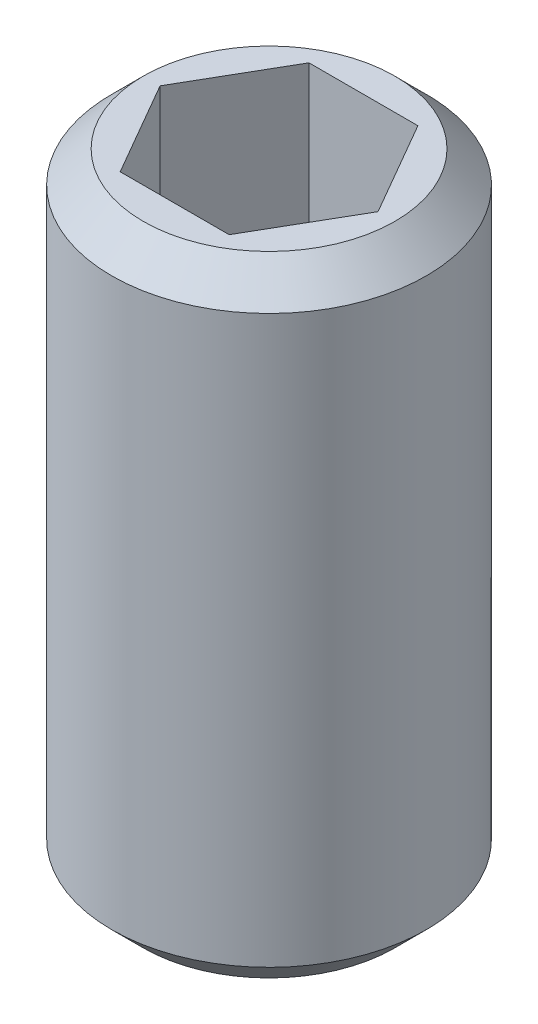
ISO-10303-21;
HEADER;
FILE_DESCRIPTION(('STEP AP214'),'2;1');
FILE_NAME('part.step','',(''),(''),'','','');
FILE_SCHEMA(('AUTOMOTIVE_DESIGN { 1 0 10303 214 1 1 1 1 }'));
ENDSEC;
DATA;
#1=APPLICATION_CONTEXT('core data for automotive mechanical design processes');
#2=APPLICATION_PROTOCOL_DEFINITION('international standard','automotive_design',2000,#1);
#3=PRODUCT_CONTEXT('',#1,'mechanical');
#4=PRODUCT('Part','Part','',(#3));
#5=PRODUCT_RELATED_PRODUCT_CATEGORY('part','',(#4));
#6=PRODUCT_DEFINITION_FORMATION('','',#4);
#7=PRODUCT_DEFINITION_CONTEXT('part definition',#1,'design');
#8=PRODUCT_DEFINITION('design','',#6,#7);
#9=PRODUCT_DEFINITION_SHAPE('','',#8);
#10=(LENGTH_UNIT() NAMED_UNIT(*) SI_UNIT(.MILLI.,.METRE.));
#11=(NAMED_UNIT(*) PLANE_ANGLE_UNIT() SI_UNIT($,.RADIAN.));
#12=(NAMED_UNIT(*) SI_UNIT($,.STERADIAN.) SOLID_ANGLE_UNIT());
#13=UNCERTAINTY_MEASURE_WITH_UNIT(LENGTH_MEASURE(1.E-05),#10,'distance_accuracy_value','');
#14=(GEOMETRIC_REPRESENTATION_CONTEXT(3) GLOBAL_UNCERTAINTY_ASSIGNED_CONTEXT((#13)) GLOBAL_UNIT_ASSIGNED_CONTEXT((#10,
#11,#12)) REPRESENTATION_CONTEXT('',''));
#15=CARTESIAN_POINT('',(0.,0.,0.));
#16=DIRECTION('',(0.,0.,1.));
#17=DIRECTION('',(1.,0.,0.));
#18=AXIS2_PLACEMENT_3D('',#15,#16,#17);
#19=CARTESIAN_POINT('',(42.2075255899707,10.,-13.1133240942481));
#20=DIRECTION('',(0.,-1.,0.));
#21=DIRECTION('',(0.,0.,-1.));
#22=AXIS2_PLACEMENT_3D('',#19,#20,#21);
#23=CYLINDRICAL_SURFACE('',#22,2.5);
#24=CARTESIAN_POINT('',(42.2075255899707,0.500000000000002,-13.1133240942481));
#25=DIRECTION('',(0.,1.,0.));
#26=DIRECTION('',(0.,0.,1.));
#27=AXIS2_PLACEMENT_3D('',#24,#25,#26);
#28=CIRCLE('',#27,2.5);
#29=CARTESIAN_POINT('',(42.2075255899707,0.500000000000002,-10.6133240942481));
#30=VERTEX_POINT('',#29);
#31=EDGE_CURVE('E150',#30,#30,#28,.T.);
#32=ORIENTED_EDGE('',*,*,#31,.T.);
#33=EDGE_LOOP('',(#32));
#34=FACE_BOUND('',#33,.T.);
#35=CARTESIAN_POINT('',(42.2075255899707,9.49999999999999,-13.1133240942481));
#36=DIRECTION('',(0.,1.,0.));
#37=DIRECTION('',(0.,0.,1.));
#38=AXIS2_PLACEMENT_3D('',#35,#36,#37);
#39=CIRCLE('',#38,2.5);
#40=CARTESIAN_POINT('',(42.2075255899707,9.49999999999999,-10.6133240942481));
#41=VERTEX_POINT('',#40);
#42=EDGE_CURVE('E142',#41,#41,#39,.F.);
#43=ORIENTED_EDGE('',*,*,#42,.T.);
#44=EDGE_LOOP('',(#43));
#45=FACE_BOUND('',#44,.T.);
#46=ADVANCED_FACE('F39',(#34,#45),#23,.T.);
#47=CARTESIAN_POINT('',(42.2075255899707,10.,-13.1133240942481));
#48=DIRECTION('',(0.,1.,0.));
#49=DIRECTION('',(0.,0.,1.));
#50=AXIS2_PLACEMENT_3D('',#47,#48,#49);
#51=PLANE('',#50);
#52=CARTESIAN_POINT('',(42.2075255899707,10.,-13.1133240942481));
#53=DIRECTION('',(0.,1.,0.));
#54=DIRECTION('',(0.,0.,1.));
#55=AXIS2_PLACEMENT_3D('',#52,#53,#54);
#56=CIRCLE('',#55,2.);
#57=CARTESIAN_POINT('',(42.2075255899707,10.,-11.1133240942481));
#58=VERTEX_POINT('',#57);
#59=EDGE_CURVE('E11',#58,#58,#56,.T.);
#60=ORIENTED_EDGE('',*,*,#59,.T.);
#61=EDGE_LOOP('',(#60));
#62=FACE_BOUND('',#61,.T.);
#63=DIRECTION('',(0.499999999999999,0.,-0.866025403784439));
#64=VECTOR('',#63,1.);
#65=CARTESIAN_POINT('',(43.0735509937552,10.,-11.6133240942481));
#66=LINE('',#65,#64);
#67=CARTESIAN_POINT('',(43.0735509937552,10.,-11.6133240942481));
#68=VERTEX_POINT('',#67);
#69=CARTESIAN_POINT('',(43.9395763975396,10.,-13.1133240942481));
#70=VERTEX_POINT('',#69);
#71=EDGE_CURVE('E55',#68,#70,#66,.T.);
#72=ORIENTED_EDGE('',*,*,#71,.F.);
#73=DIRECTION('',(1.,0.,0.));
#74=VECTOR('',#73,1.);
#75=CARTESIAN_POINT('',(41.3415001861863,10.,-11.6133240942481));
#76=LINE('',#75,#74);
#77=CARTESIAN_POINT('',(41.3415001861863,10.,-11.6133240942481));
#78=VERTEX_POINT('',#77);
#79=EDGE_CURVE('E138',#78,#68,#76,.T.);
#80=ORIENTED_EDGE('',*,*,#79,.F.);
#81=DIRECTION('',(0.500000000000001,0.,0.866025403784438));
#82=VECTOR('',#81,1.);
#83=CARTESIAN_POINT('',(40.4754747824018,10.,-13.1133240942481));
#84=LINE('',#83,#82);
#85=CARTESIAN_POINT('',(40.4754747824018,10.,-13.1133240942481));
#86=VERTEX_POINT('',#85);
#87=EDGE_CURVE('E136',#86,#78,#84,.T.);
#88=ORIENTED_EDGE('',*,*,#87,.F.);
#89=DIRECTION('',(-0.500000000000002,0.,0.866025403784438));
#90=VECTOR('',#89,1.);
#91=CARTESIAN_POINT('',(41.3415001861863,10.,-14.6133240942482));
#92=LINE('',#91,#90);
#93=CARTESIAN_POINT('',(41.3415001861863,10.,-14.6133240942482));
#94=VERTEX_POINT('',#93);
#95=EDGE_CURVE('E103',#94,#86,#92,.T.);
#96=ORIENTED_EDGE('',*,*,#95,.F.);
#97=DIRECTION('',(-1.,0.,0.));
#98=VECTOR('',#97,1.);
#99=CARTESIAN_POINT('',(43.0735509937552,10.,-14.6133240942482));
#100=LINE('',#99,#98);
#101=CARTESIAN_POINT('',(43.0735509937552,10.,-14.6133240942482));
#102=VERTEX_POINT('',#101);
#103=EDGE_CURVE('E132',#102,#94,#100,.T.);
#104=ORIENTED_EDGE('',*,*,#103,.F.);
#105=DIRECTION('',(-0.499999999999998,0.,-0.86602540378444));
#106=VECTOR('',#105,1.);
#107=CARTESIAN_POINT('',(43.9395763975396,10.,-13.1133240942481));
#108=LINE('',#107,#106);
#109=EDGE_CURVE('E129',#70,#102,#108,.T.);
#110=ORIENTED_EDGE('',*,*,#109,.F.);
#111=EDGE_LOOP('',(#72,#80,#88,#96,#104,#110));
#112=FACE_BOUND('',#111,.T.);
#113=ADVANCED_FACE('F164',(#62,#112),#51,.T.);
#114=CARTESIAN_POINT('',(42.2075255899707,0.,-13.1133240942481));
#115=DIRECTION('',(0.,1.,0.));
#116=DIRECTION('',(0.,0.,1.));
#117=AXIS2_PLACEMENT_3D('',#114,#115,#116);
#118=PLANE('',#117);
#119=CARTESIAN_POINT('',(42.2075255899707,0.,-13.1133240942481));
#120=DIRECTION('',(0.,1.,0.));
#121=DIRECTION('',(0.,0.,1.));
#122=AXIS2_PLACEMENT_3D('',#119,#120,#121);
#123=CIRCLE('',#122,2.);
#124=CARTESIAN_POINT('',(42.2075255899707,0.,-11.1133240942481));
#125=VERTEX_POINT('',#124);
#126=EDGE_CURVE('E48',#125,#125,#123,.F.);
#127=ORIENTED_EDGE('',*,*,#126,.T.);
#128=EDGE_LOOP('',(#127));
#129=FACE_BOUND('',#128,.T.);
#130=ADVANCED_FACE('F155',(#129),#118,.F.);
#131=CARTESIAN_POINT('',(43.0735509937552,7.,-11.6133240942481));
#132=DIRECTION('',(0.866025403784439,0.,0.499999999999999));
#133=DIRECTION('',(0.499999999999999,0.,-0.866025403784439));
#134=AXIS2_PLACEMENT_3D('',#131,#132,#133);
#135=PLANE('',#134);
#136=ORIENTED_EDGE('',*,*,#71,.T.);
#137=DIRECTION('',(0.,1.,0.));
#138=VECTOR('',#137,1.);
#139=CARTESIAN_POINT('',(43.9395763975396,7.,-13.1133240942481));
#140=LINE('',#139,#138);
#141=CARTESIAN_POINT('',(43.9395763975396,7.,-13.1133240942481));
#142=VERTEX_POINT('',#141);
#143=EDGE_CURVE('E85',#142,#70,#140,.T.);
#144=ORIENTED_EDGE('',*,*,#143,.F.);
#145=DIRECTION('',(0.499999999999999,0.,-0.866025403784439));
#146=VECTOR('',#145,1.);
#147=CARTESIAN_POINT('',(43.0735509937552,7.,-11.6133240942481));
#148=LINE('',#147,#146);
#149=CARTESIAN_POINT('',(43.0735509937552,7.,-11.6133240942481));
#150=VERTEX_POINT('',#149);
#151=EDGE_CURVE('E140',#150,#142,#148,.T.);
#152=ORIENTED_EDGE('',*,*,#151,.F.);
#153=DIRECTION('',(0.,1.,0.));
#154=VECTOR('',#153,1.);
#155=CARTESIAN_POINT('',(43.0735509937552,7.,-11.6133240942481));
#156=LINE('',#155,#154);
#157=EDGE_CURVE('E63',#150,#68,#156,.T.);
#158=ORIENTED_EDGE('',*,*,#157,.T.);
#159=EDGE_LOOP('',(#136,#144,#152,#158));
#160=FACE_BOUND('',#159,.T.);
#161=ADVANCED_FACE('F181',(#160),#135,.F.);
#162=CARTESIAN_POINT('',(41.3415001861863,7.,-11.6133240942481));
#163=DIRECTION('',(0.,0.,1.));
#164=DIRECTION('',(1.,0.,0.));
#165=AXIS2_PLACEMENT_3D('',#162,#163,#164);
#166=PLANE('',#165);
#167=ORIENTED_EDGE('',*,*,#79,.T.);
#168=ORIENTED_EDGE('',*,*,#157,.F.);
#169=DIRECTION('',(1.,0.,0.));
#170=VECTOR('',#169,1.);
#171=CARTESIAN_POINT('',(41.3415001861863,7.,-11.6133240942481));
#172=LINE('',#171,#170);
#173=CARTESIAN_POINT('',(41.3415001861863,7.,-11.6133240942481));
#174=VERTEX_POINT('',#173);
#175=EDGE_CURVE('E115',#174,#150,#172,.T.);
#176=ORIENTED_EDGE('',*,*,#175,.F.);
#177=DIRECTION('',(0.,1.,0.));
#178=VECTOR('',#177,1.);
#179=CARTESIAN_POINT('',(41.3415001861863,7.,-11.6133240942481));
#180=LINE('',#179,#178);
#181=EDGE_CURVE('E107',#174,#78,#180,.T.);
#182=ORIENTED_EDGE('',*,*,#181,.T.);
#183=EDGE_LOOP('',(#167,#168,#176,#182));
#184=FACE_BOUND('',#183,.T.);
#185=ADVANCED_FACE('F183',(#184),#166,.F.);
#186=CARTESIAN_POINT('',(40.4754747824018,7.,-13.1133240942481));
#187=DIRECTION('',(-0.866025403784438,0.,0.500000000000001));
#188=DIRECTION('',(0.500000000000001,0.,0.866025403784438));
#189=AXIS2_PLACEMENT_3D('',#186,#187,#188);
#190=PLANE('',#189);
#191=ORIENTED_EDGE('',*,*,#87,.T.);
#192=ORIENTED_EDGE('',*,*,#181,.F.);
#193=DIRECTION('',(0.500000000000001,0.,0.866025403784438));
#194=VECTOR('',#193,1.);
#195=CARTESIAN_POINT('',(40.4754747824018,7.,-13.1133240942481));
#196=LINE('',#195,#194);
#197=CARTESIAN_POINT('',(40.4754747824018,7.,-13.1133240942481));
#198=VERTEX_POINT('',#197);
#199=EDGE_CURVE('E111',#198,#174,#196,.T.);
#200=ORIENTED_EDGE('',*,*,#199,.F.);
#201=DIRECTION('',(0.,1.,0.));
#202=VECTOR('',#201,1.);
#203=CARTESIAN_POINT('',(40.4754747824018,7.,-13.1133240942481));
#204=LINE('',#203,#202);
#205=EDGE_CURVE('E96',#198,#86,#204,.T.);
#206=ORIENTED_EDGE('',*,*,#205,.T.);
#207=EDGE_LOOP('',(#191,#192,#200,#206));
#208=FACE_BOUND('',#207,.T.);
#209=ADVANCED_FACE('F112',(#208),#190,.F.);
#210=CARTESIAN_POINT('',(41.3415001861863,7.,-14.6133240942482));
#211=DIRECTION('',(-0.866025403784438,0.,-0.500000000000002));
#212=DIRECTION('',(-0.500000000000002,0.,0.866025403784438));
#213=AXIS2_PLACEMENT_3D('',#210,#211,#212);
#214=PLANE('',#213);
#215=ORIENTED_EDGE('',*,*,#95,.T.);
#216=ORIENTED_EDGE('',*,*,#205,.F.);
#217=DIRECTION('',(-0.500000000000002,0.,0.866025403784438));
#218=VECTOR('',#217,1.);
#219=CARTESIAN_POINT('',(41.3415001861863,7.,-14.6133240942482));
#220=LINE('',#219,#218);
#221=CARTESIAN_POINT('',(41.3415001861863,7.,-14.6133240942482));
#222=VERTEX_POINT('',#221);
#223=EDGE_CURVE('E100',#222,#198,#220,.T.);
#224=ORIENTED_EDGE('',*,*,#223,.F.);
#225=DIRECTION('',(0.,1.,0.));
#226=VECTOR('',#225,1.);
#227=CARTESIAN_POINT('',(41.3415001861863,7.,-14.6133240942482));
#228=LINE('',#227,#226);
#229=EDGE_CURVE('E108',#222,#94,#228,.T.);
#230=ORIENTED_EDGE('',*,*,#229,.T.);
#231=EDGE_LOOP('',(#215,#216,#224,#230));
#232=FACE_BOUND('',#231,.T.);
#233=ADVANCED_FACE('F98',(#232),#214,.F.);
#234=CARTESIAN_POINT('',(43.0735509937552,7.,-14.6133240942482));
#235=DIRECTION('',(0.,0.,-1.));
#236=DIRECTION('',(-1.,0.,0.));
#237=AXIS2_PLACEMENT_3D('',#234,#235,#236);
#238=PLANE('',#237);
#239=ORIENTED_EDGE('',*,*,#103,.T.);
#240=ORIENTED_EDGE('',*,*,#229,.F.);
#241=DIRECTION('',(-1.,0.,0.));
#242=VECTOR('',#241,1.);
#243=CARTESIAN_POINT('',(43.0735509937552,7.,-14.6133240942482));
#244=LINE('',#243,#242);
#245=CARTESIAN_POINT('',(43.0735509937552,7.,-14.6133240942482));
#246=VERTEX_POINT('',#245);
#247=EDGE_CURVE('E121',#246,#222,#244,.T.);
#248=ORIENTED_EDGE('',*,*,#247,.F.);
#249=DIRECTION('',(0.,1.,0.));
#250=VECTOR('',#249,1.);
#251=CARTESIAN_POINT('',(43.0735509937552,7.,-14.6133240942482));
#252=LINE('',#251,#250);
#253=EDGE_CURVE('E145',#246,#102,#252,.T.);
#254=ORIENTED_EDGE('',*,*,#253,.T.);
#255=EDGE_LOOP('',(#239,#240,#248,#254));
#256=FACE_BOUND('',#255,.T.);
#257=ADVANCED_FACE('F199',(#256),#238,.F.);
#258=CARTESIAN_POINT('',(43.9395763975396,7.,-13.1133240942481));
#259=DIRECTION('',(0.86602540378444,0.,-0.499999999999998));
#260=DIRECTION('',(-0.499999999999998,0.,-0.86602540378444));
#261=AXIS2_PLACEMENT_3D('',#258,#259,#260);
#262=PLANE('',#261);
#263=ORIENTED_EDGE('',*,*,#109,.T.);
#264=ORIENTED_EDGE('',*,*,#253,.F.);
#265=DIRECTION('',(-0.499999999999998,0.,-0.86602540378444));
#266=VECTOR('',#265,1.);
#267=CARTESIAN_POINT('',(43.9395763975396,7.,-13.1133240942481));
#268=LINE('',#267,#266);
#269=EDGE_CURVE('E123',#142,#246,#268,.T.);
#270=ORIENTED_EDGE('',*,*,#269,.F.);
#271=ORIENTED_EDGE('',*,*,#143,.T.);
#272=EDGE_LOOP('',(#263,#264,#270,#271));
#273=FACE_BOUND('',#272,.T.);
#274=ADVANCED_FACE('F179',(#273),#262,.F.);
#275=CARTESIAN_POINT('',(0.,7.,0.));
#276=DIRECTION('',(0.,1.,0.));
#277=DIRECTION('',(0.,0.,1.));
#278=AXIS2_PLACEMENT_3D('',#275,#276,#277);
#279=PLANE('',#278);
#280=ORIENTED_EDGE('',*,*,#151,.T.);
#281=ORIENTED_EDGE('',*,*,#269,.T.);
#282=ORIENTED_EDGE('',*,*,#247,.T.);
#283=ORIENTED_EDGE('',*,*,#223,.T.);
#284=ORIENTED_EDGE('',*,*,#199,.T.);
#285=ORIENTED_EDGE('',*,*,#175,.T.);
#286=EDGE_LOOP('',(#280,#281,#282,#283,#284,#285));
#287=FACE_BOUND('',#286,.T.);
#288=ADVANCED_FACE('F118',(#287),#279,.T.);
#289=CARTESIAN_POINT('',(42.2075255899707,0.500000000000002,-13.1133240942481));
#290=DIRECTION('',(0.,1.,0.));
#291=DIRECTION('',(0.,0.,1.));
#292=AXIS2_PLACEMENT_3D('',#289,#290,#291);
#293=CONICAL_SURFACE('',#292,2.5,0.78539816339745);
#294=ORIENTED_EDGE('',*,*,#126,.F.);
#295=EDGE_LOOP('',(#294));
#296=FACE_BOUND('',#295,.T.);
#297=ORIENTED_EDGE('',*,*,#31,.F.);
#298=EDGE_LOOP('',(#297));
#299=FACE_BOUND('',#298,.T.);
#300=ADVANCED_FACE('F157',(#296,#299),#293,.T.);
#301=CARTESIAN_POINT('',(42.2075255899707,10.,-13.1133240942481));
#302=DIRECTION('',(0.,-1.,0.));
#303=DIRECTION('',(0.,0.,-1.));
#304=AXIS2_PLACEMENT_3D('',#301,#302,#303);
#305=CONICAL_SURFACE('',#304,2.,0.785398163397447);
#306=ORIENTED_EDGE('',*,*,#42,.F.);
#307=EDGE_LOOP('',(#306));
#308=FACE_BOUND('',#307,.T.);
#309=ORIENTED_EDGE('',*,*,#59,.F.);
#310=EDGE_LOOP('',(#309));
#311=FACE_BOUND('',#310,.T.);
#312=ADVANCED_FACE('F42',(#308,#311),#305,.T.);
#313=CLOSED_SHELL('',(#46,#113,#130,#161,#185,#209,#233,#257,#274,#288,#300,#312));
#314=MANIFOLD_SOLID_BREP('B2',#313);
#315=ADVANCED_BREP_SHAPE_REPRESENTATION('',(#18,#314),#14);
#316=SHAPE_DEFINITION_REPRESENTATION(#9,#315);
ENDSEC;
END-ISO-10303-21;
